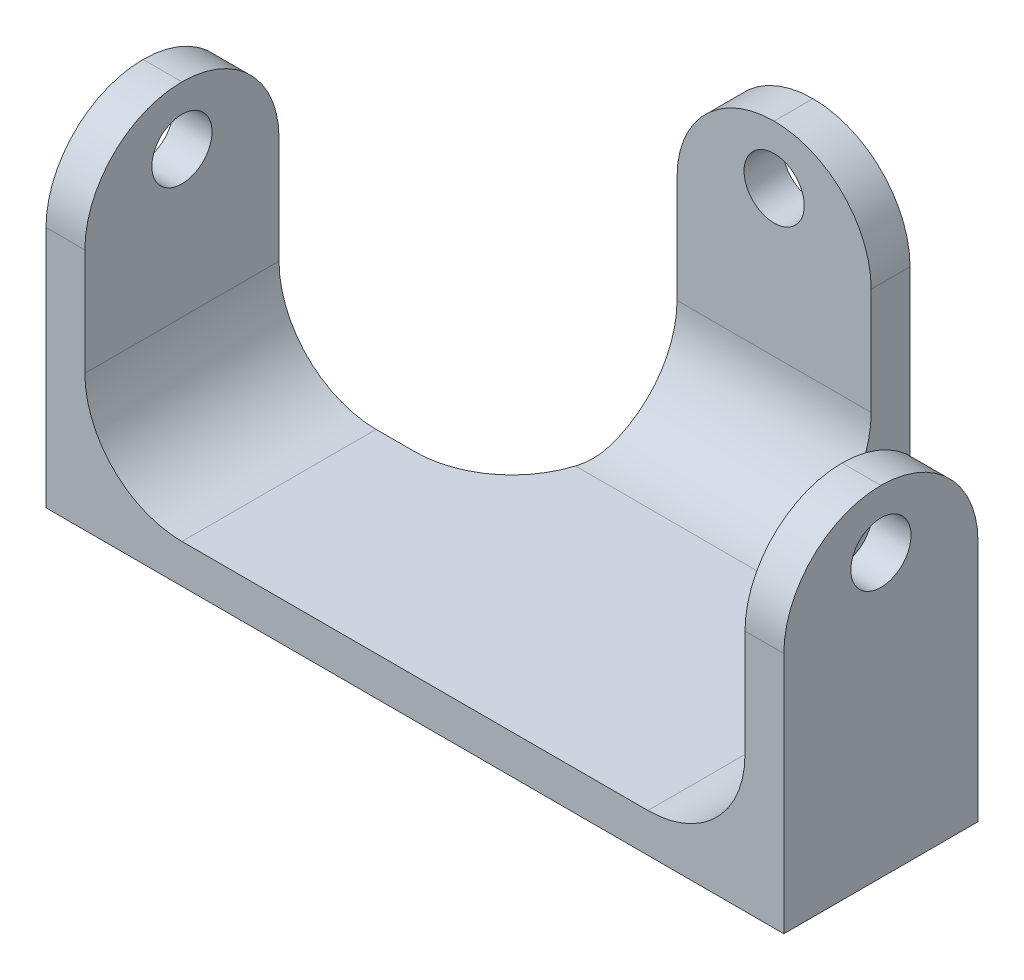
ISO-10303-21;
HEADER;
FILE_DESCRIPTION(('STEP AP214'),'2;1');
FILE_NAME('part.step','',(''),(''),'','','');
FILE_SCHEMA(('AUTOMOTIVE_DESIGN { 1 0 10303 214 1 1 1 1 }'));
ENDSEC;
DATA;
#1=APPLICATION_CONTEXT('core data for automotive mechanical design processes');
#2=APPLICATION_PROTOCOL_DEFINITION('international standard','automotive_design',2000,#1);
#3=PRODUCT_CONTEXT('',#1,'mechanical');
#4=PRODUCT('Part','Part','',(#3));
#5=PRODUCT_RELATED_PRODUCT_CATEGORY('part','',(#4));
#6=PRODUCT_DEFINITION_FORMATION('','',#4);
#7=PRODUCT_DEFINITION_CONTEXT('part definition',#1,'design');
#8=PRODUCT_DEFINITION('design','',#6,#7);
#9=PRODUCT_DEFINITION_SHAPE('','',#8);
#10=(LENGTH_UNIT() NAMED_UNIT(*) SI_UNIT(.MILLI.,.METRE.));
#11=(NAMED_UNIT(*) PLANE_ANGLE_UNIT() SI_UNIT($,.RADIAN.));
#12=(NAMED_UNIT(*) SI_UNIT($,.STERADIAN.) SOLID_ANGLE_UNIT());
#13=UNCERTAINTY_MEASURE_WITH_UNIT(LENGTH_MEASURE(1.E-05),#10,'distance_accuracy_value','');
#14=(GEOMETRIC_REPRESENTATION_CONTEXT(3) GLOBAL_UNCERTAINTY_ASSIGNED_CONTEXT((#13)) GLOBAL_UNIT_ASSIGNED_CONTEXT((#10,
#11,#12)) REPRESENTATION_CONTEXT('',''));
#15=CARTESIAN_POINT('',(0.,0.,0.));
#16=DIRECTION('',(0.,0.,1.));
#17=DIRECTION('',(1.,0.,0.));
#18=AXIS2_PLACEMENT_3D('',#15,#16,#17);
#19=CARTESIAN_POINT('',(-6.63941409911649,-24.1824796838979,62.));
#20=DIRECTION('',(0.,-1.,0.));
#21=DIRECTION('',(1.,0.,0.));
#22=AXIS2_PLACEMENT_3D('',#19,#20,#21);
#23=PLANE('',#22);
#24=DIRECTION('',(1.,0.,0.));
#25=VECTOR('',#24,1.);
#26=CARTESIAN_POINT('',(17.3605859008835,-24.1824796838979,14.));
#27=LINE('',#26,#25);
#28=CARTESIAN_POINT('',(37.821193886714,-24.1824796838979,14.));
#29=VERTEX_POINT('',#28);
#30=CARTESIAN_POINT('',(16.899977915053,-24.1824796838979,14.));
#31=VERTEX_POINT('',#30);
#32=EDGE_CURVE('E53',#29,#31,#27,.F.);
#33=ORIENTED_EDGE('',*,*,#32,.T.);
#34=CARTESIAN_POINT('',(7.3605859008835,-24.1824796838979,11.));
#35=DIRECTION('',(0.,-1.,0.));
#36=DIRECTION('',(1.,0.,0.));
#37=AXIS2_PLACEMENT_3D('',#34,#35,#36);
#38=CIRCLE('',#37,10.);
#39=CARTESIAN_POINT('',(7.3605859008835,-24.1824796838979,21.));
#40=VERTEX_POINT('',#39);
#41=EDGE_CURVE('E318',#31,#40,#38,.T.);
#42=ORIENTED_EDGE('',*,*,#41,.T.);
#43=DIRECTION('',(-1.,0.,0.));
#44=VECTOR('',#43,1.);
#45=CARTESIAN_POINT('',(-6.63941409911649,-24.1824796838979,21.));
#46=LINE('',#45,#44);
#47=CARTESIAN_POINT('',(3.3605859008835,-24.1824796838979,21.));
#48=VERTEX_POINT('',#47);
#49=EDGE_CURVE('E397',#40,#48,#46,.T.);
#50=ORIENTED_EDGE('',*,*,#49,.T.);
#51=DIRECTION('',(0.,0.,-1.));
#52=VECTOR('',#51,1.);
#53=CARTESIAN_POINT('',(3.3605859008835,-24.1824796838979,41.));
#54=LINE('',#53,#52);
#55=CARTESIAN_POINT('',(3.3605859008835,-24.1824796838979,41.));
#56=VERTEX_POINT('',#55);
#57=EDGE_CURVE('E274',#48,#56,#54,.F.);
#58=ORIENTED_EDGE('',*,*,#57,.T.);
#59=DIRECTION('',(1.,0.,0.));
#60=VECTOR('',#59,1.);
#61=CARTESIAN_POINT('',(-6.63941409911649,-24.1824796838979,41.));
#62=LINE('',#61,#60);
#63=CARTESIAN_POINT('',(51.3605859008835,-24.1824796838979,41.));
#64=VERTEX_POINT('',#63);
#65=EDGE_CURVE('E392',#56,#64,#62,.T.);
#66=ORIENTED_EDGE('',*,*,#65,.T.);
#67=DIRECTION('',(0.,0.,-1.));
#68=VECTOR('',#67,1.);
#69=CARTESIAN_POINT('',(51.3605859008835,-24.1824796838979,21.));
#70=LINE('',#69,#68);
#71=CARTESIAN_POINT('',(51.3605859008835,-24.1824796838979,21.));
#72=VERTEX_POINT('',#71);
#73=EDGE_CURVE('E270',#64,#72,#70,.T.);
#74=ORIENTED_EDGE('',*,*,#73,.T.);
#75=DIRECTION('',(-1.,0.,0.));
#76=VECTOR('',#75,1.);
#77=CARTESIAN_POINT('',(-6.63941409911649,-24.1824796838979,21.));
#78=LINE('',#77,#76);
#79=CARTESIAN_POINT('',(47.3605859008835,-24.1824796838979,21.));
#80=VERTEX_POINT('',#79);
#81=EDGE_CURVE('E407',#72,#80,#78,.T.);
#82=ORIENTED_EDGE('',*,*,#81,.T.);
#83=CARTESIAN_POINT('',(47.3605859008835,-24.1824796838979,11.));
#84=DIRECTION('',(0.,-1.,0.));
#85=DIRECTION('',(1.,0.,0.));
#86=AXIS2_PLACEMENT_3D('',#83,#84,#85);
#87=CIRCLE('',#86,10.);
#88=EDGE_CURVE('E47',#80,#29,#87,.T.);
#89=ORIENTED_EDGE('',*,*,#88,.T.);
#90=EDGE_LOOP('',(#33,#42,#50,#58,#66,#74,#82,#89));
#91=FACE_BOUND('',#90,.T.);
#92=ADVANCED_FACE('F33',(#91),#23,.F.);
#93=CARTESIAN_POINT('',(-10.6394140991165,-28.1824796838979,62.));
#94=DIRECTION('',(1.,0.,0.));
#95=DIRECTION('',(0.,1.,0.));
#96=AXIS2_PLACEMENT_3D('',#93,#94,#95);
#97=PLANE('',#96);
#98=CARTESIAN_POINT('',(-10.6394140991165,0.817520316102066,31.));
#99=DIRECTION('',(1.,0.,0.));
#100=DIRECTION('',(0.,1.,0.));
#101=AXIS2_PLACEMENT_3D('',#98,#99,#100);
#102=CIRCLE('',#101,3.1);
#103=CARTESIAN_POINT('',(-10.6394140991165,3.91752031610207,31.));
#104=VERTEX_POINT('',#103);
#105=EDGE_CURVE('E223',#104,#104,#102,.T.);
#106=ORIENTED_EDGE('',*,*,#105,.T.);
#107=EDGE_LOOP('',(#106));
#108=FACE_BOUND('',#107,.T.);
#109=CARTESIAN_POINT('',(-10.6394140991165,-3.18247968389794,31.));
#110=DIRECTION('',(1.,0.,0.));
#111=DIRECTION('',(0.,1.,0.));
#112=AXIS2_PLACEMENT_3D('',#109,#110,#111);
#113=CIRCLE('',#112,10.);
#114=CARTESIAN_POINT('',(-10.6394140991165,-3.18247968389794,41.));
#115=VERTEX_POINT('',#114);
#116=CARTESIAN_POINT('',(-10.6394140991165,6.81752031610207,31.));
#117=VERTEX_POINT('',#116);
#118=EDGE_CURVE('E240',#115,#117,#113,.F.);
#119=ORIENTED_EDGE('',*,*,#118,.T.);
#120=CARTESIAN_POINT('',(-10.6394140991165,-3.18247968389794,31.));
#121=DIRECTION('',(1.,0.,0.));
#122=DIRECTION('',(0.,1.,0.));
#123=AXIS2_PLACEMENT_3D('',#120,#121,#122);
#124=CIRCLE('',#123,10.);
#125=CARTESIAN_POINT('',(-10.6394140991165,-3.18247968389794,21.));
#126=VERTEX_POINT('',#125);
#127=EDGE_CURVE('E242',#117,#126,#124,.F.);
#128=ORIENTED_EDGE('',*,*,#127,.T.);
#129=DIRECTION('',(0.,-1.,0.));
#130=VECTOR('',#129,1.);
#131=CARTESIAN_POINT('',(-10.6394140991165,6.81752031610207,21.));
#132=LINE('',#131,#130);
#133=CARTESIAN_POINT('',(-10.6394140991165,-28.1824796838979,21.));
#134=VERTEX_POINT('',#133);
#135=EDGE_CURVE('E206',#126,#134,#132,.T.);
#136=ORIENTED_EDGE('',*,*,#135,.T.);
#137=DIRECTION('',(0.,0.,-1.));
#138=VECTOR('',#137,1.);
#139=CARTESIAN_POINT('',(-10.6394140991165,-28.1824796838979,62.));
#140=LINE('',#139,#138);
#141=CARTESIAN_POINT('',(-10.6394140991165,-28.1824796838979,41.));
#142=VERTEX_POINT('',#141);
#143=EDGE_CURVE('E202',#142,#134,#140,.T.);
#144=ORIENTED_EDGE('',*,*,#143,.F.);
#145=DIRECTION('',(0.,-1.,0.));
#146=VECTOR('',#145,1.);
#147=CARTESIAN_POINT('',(-10.6394140991165,6.81752031610207,41.));
#148=LINE('',#147,#146);
#149=EDGE_CURVE('E184',#115,#142,#148,.T.);
#150=ORIENTED_EDGE('',*,*,#149,.F.);
#151=EDGE_LOOP('',(#119,#128,#136,#144,#150));
#152=FACE_BOUND('',#151,.T.);
#153=ADVANCED_FACE('F209',(#108,#152),#97,.F.);
#154=CARTESIAN_POINT('',(65.3605859008835,-28.1824796838979,62.));
#155=DIRECTION('',(0.,1.,0.));
#156=DIRECTION('',(-1.,0.,0.));
#157=AXIS2_PLACEMENT_3D('',#154,#155,#156);
#158=PLANE('',#157);
#159=DIRECTION('',(0.,0.,-1.));
#160=VECTOR('',#159,1.);
#161=CARTESIAN_POINT('',(65.3605859008835,-28.1824796838979,62.));
#162=LINE('',#161,#160);
#163=CARTESIAN_POINT('',(65.3605859008835,-28.1824796838979,41.));
#164=VERTEX_POINT('',#163);
#165=CARTESIAN_POINT('',(65.3605859008835,-28.1824796838979,21.));
#166=VERTEX_POINT('',#165);
#167=EDGE_CURVE('E205',#164,#166,#162,.T.);
#168=ORIENTED_EDGE('',*,*,#167,.F.);
#169=DIRECTION('',(1.,0.,0.));
#170=VECTOR('',#169,1.);
#171=CARTESIAN_POINT('',(-10.6394140991165,-28.1824796838979,41.));
#172=LINE('',#171,#170);
#173=EDGE_CURVE('E188',#142,#164,#172,.T.);
#174=ORIENTED_EDGE('',*,*,#173,.F.);
#175=ORIENTED_EDGE('',*,*,#143,.T.);
#176=DIRECTION('',(-1.,0.,0.));
#177=VECTOR('',#176,1.);
#178=CARTESIAN_POINT('',(-10.6394140991165,-28.1824796838979,21.));
#179=LINE('',#178,#177);
#180=CARTESIAN_POINT('',(7.3605859008835,-28.1824796838979,21.));
#181=VERTEX_POINT('',#180);
#182=EDGE_CURVE('E443',#181,#134,#179,.T.);
#183=ORIENTED_EDGE('',*,*,#182,.F.);
#184=CARTESIAN_POINT('',(7.3605859008835,-28.1824796838979,11.));
#185=DIRECTION('',(0.,1.,0.));
#186=DIRECTION('',(-1.,0.,0.));
#187=AXIS2_PLACEMENT_3D('',#184,#185,#186);
#188=CIRCLE('',#187,10.);
#189=CARTESIAN_POINT('',(17.3605859008835,-28.1824796838979,11.));
#190=VERTEX_POINT('',#189);
#191=EDGE_CURVE('E310',#181,#190,#188,.T.);
#192=ORIENTED_EDGE('',*,*,#191,.T.);
#193=DIRECTION('',(0.,0.,1.));
#194=VECTOR('',#193,1.);
#195=CARTESIAN_POINT('',(17.3605859008835,-28.1824796838979,0.));
#196=LINE('',#195,#194);
#197=CARTESIAN_POINT('',(17.3605859008835,-28.1824796838979,0.));
#198=VERTEX_POINT('',#197);
#199=EDGE_CURVE('E428',#198,#190,#196,.T.);
#200=ORIENTED_EDGE('',*,*,#199,.F.);
#201=DIRECTION('',(1.,0.,0.));
#202=VECTOR('',#201,1.);
#203=CARTESIAN_POINT('',(65.3605859008835,-28.1824796838979,0.));
#204=LINE('',#203,#202);
#205=CARTESIAN_POINT('',(37.3605859008835,-28.1824796838979,0.));
#206=VERTEX_POINT('',#205);
#207=EDGE_CURVE('E216',#198,#206,#204,.T.);
#208=ORIENTED_EDGE('',*,*,#207,.T.);
#209=DIRECTION('',(0.,0.,-1.));
#210=VECTOR('',#209,1.);
#211=CARTESIAN_POINT('',(37.3605859008835,-28.1824796838979,0.));
#212=LINE('',#211,#210);
#213=CARTESIAN_POINT('',(37.3605859008835,-28.1824796838979,11.));
#214=VERTEX_POINT('',#213);
#215=EDGE_CURVE('E426',#214,#206,#212,.T.);
#216=ORIENTED_EDGE('',*,*,#215,.F.);
#217=CARTESIAN_POINT('',(47.3605859008835,-28.1824796838979,11.));
#218=DIRECTION('',(0.,1.,0.));
#219=DIRECTION('',(-1.,0.,0.));
#220=AXIS2_PLACEMENT_3D('',#217,#218,#219);
#221=CIRCLE('',#220,10.);
#222=CARTESIAN_POINT('',(47.3605859008835,-28.1824796838979,21.));
#223=VERTEX_POINT('',#222);
#224=EDGE_CURVE('E472',#214,#223,#221,.T.);
#225=ORIENTED_EDGE('',*,*,#224,.T.);
#226=DIRECTION('',(-1.,0.,0.));
#227=VECTOR('',#226,1.);
#228=CARTESIAN_POINT('',(65.3605859008835,-28.1824796838979,21.));
#229=LINE('',#228,#227);
#230=EDGE_CURVE('E294',#166,#223,#229,.T.);
#231=ORIENTED_EDGE('',*,*,#230,.F.);
#232=EDGE_LOOP('',(#168,#174,#175,#183,#192,#200,#208,#216,#225,#231));
#233=FACE_BOUND('',#232,.T.);
#234=ADVANCED_FACE('F200',(#233),#158,.F.);
#235=CARTESIAN_POINT('',(65.3605859008835,6.81752031610207,62.));
#236=DIRECTION('',(-1.,0.,0.));
#237=DIRECTION('',(0.,0.,1.));
#238=AXIS2_PLACEMENT_3D('',#235,#236,#237);
#239=PLANE('',#238);
#240=CARTESIAN_POINT('',(65.3605859008835,0.817520316102085,31.));
#241=DIRECTION('',(1.,0.,0.));
#242=DIRECTION('',(0.,1.,0.));
#243=AXIS2_PLACEMENT_3D('',#240,#241,#242);
#244=CIRCLE('',#243,3.1);
#245=CARTESIAN_POINT('',(65.3605859008835,3.91752031610209,31.));
#246=VERTEX_POINT('',#245);
#247=EDGE_CURVE('E414',#246,#246,#244,.T.);
#248=ORIENTED_EDGE('',*,*,#247,.F.);
#249=EDGE_LOOP('',(#248));
#250=FACE_BOUND('',#249,.T.);
#251=CARTESIAN_POINT('',(65.3605859008835,-3.18247968389793,31.));
#252=DIRECTION('',(-1.,0.,0.));
#253=DIRECTION('',(0.,0.,1.));
#254=AXIS2_PLACEMENT_3D('',#251,#252,#253);
#255=CIRCLE('',#254,10.);
#256=CARTESIAN_POINT('',(65.3605859008835,-3.18247968389793,21.));
#257=VERTEX_POINT('',#256);
#258=CARTESIAN_POINT('',(65.3605859008835,6.81752031610207,31.));
#259=VERTEX_POINT('',#258);
#260=EDGE_CURVE('E214',#257,#259,#255,.F.);
#261=ORIENTED_EDGE('',*,*,#260,.T.);
#262=CARTESIAN_POINT('',(65.3605859008835,-3.18247968389793,31.));
#263=DIRECTION('',(-1.,0.,0.));
#264=DIRECTION('',(0.,0.,1.));
#265=AXIS2_PLACEMENT_3D('',#262,#263,#264);
#266=CIRCLE('',#265,10.);
#267=CARTESIAN_POINT('',(65.3605859008835,-3.18247968389793,41.));
#268=VERTEX_POINT('',#267);
#269=EDGE_CURVE('E226',#259,#268,#266,.F.);
#270=ORIENTED_EDGE('',*,*,#269,.T.);
#271=DIRECTION('',(0.,-1.,0.));
#272=VECTOR('',#271,1.);
#273=CARTESIAN_POINT('',(65.3605859008835,6.81752031610208,41.));
#274=LINE('',#273,#272);
#275=EDGE_CURVE('E196',#268,#164,#274,.T.);
#276=ORIENTED_EDGE('',*,*,#275,.T.);
#277=ORIENTED_EDGE('',*,*,#167,.T.);
#278=DIRECTION('',(0.,-1.,0.));
#279=VECTOR('',#278,1.);
#280=CARTESIAN_POINT('',(65.3605859008835,6.81752031610208,21.));
#281=LINE('',#280,#279);
#282=EDGE_CURVE('E441',#257,#166,#281,.T.);
#283=ORIENTED_EDGE('',*,*,#282,.F.);
#284=EDGE_LOOP('',(#261,#270,#276,#277,#283));
#285=FACE_BOUND('',#284,.T.);
#286=ADVANCED_FACE('F352',(#250,#285),#239,.F.);
#287=CARTESIAN_POINT('',(61.3605859008835,-24.1824796838979,62.));
#288=DIRECTION('',(1.,0.,0.));
#289=DIRECTION('',(0.,0.,-1.));
#290=AXIS2_PLACEMENT_3D('',#287,#288,#289);
#291=PLANE('',#290);
#292=CARTESIAN_POINT('',(61.3605859008835,0.817520316102084,31.));
#293=DIRECTION('',(1.,0.,0.));
#294=DIRECTION('',(0.,0.,-1.));
#295=AXIS2_PLACEMENT_3D('',#292,#293,#294);
#296=CIRCLE('',#295,3.1);
#297=CARTESIAN_POINT('',(61.3605859008835,0.817520316102084,27.9));
#298=VERTEX_POINT('',#297);
#299=EDGE_CURVE('E222',#298,#298,#296,.T.);
#300=ORIENTED_EDGE('',*,*,#299,.T.);
#301=EDGE_LOOP('',(#300));
#302=FACE_BOUND('',#301,.T.);
#303=DIRECTION('',(0.,1.,0.));
#304=VECTOR('',#303,1.);
#305=CARTESIAN_POINT('',(61.3605859008835,-24.1824796838979,41.));
#306=LINE('',#305,#304);
#307=CARTESIAN_POINT('',(61.3605859008835,-14.1824796838979,41.));
#308=VERTEX_POINT('',#307);
#309=CARTESIAN_POINT('',(61.3605859008835,-3.18247968389793,41.));
#310=VERTEX_POINT('',#309);
#311=EDGE_CURVE('E399',#308,#310,#306,.T.);
#312=ORIENTED_EDGE('',*,*,#311,.T.);
#313=CARTESIAN_POINT('',(61.3605859008835,-3.18247968389793,31.));
#314=DIRECTION('',(1.,0.,0.));
#315=DIRECTION('',(0.,0.,-1.));
#316=AXIS2_PLACEMENT_3D('',#313,#314,#315);
#317=CIRCLE('',#316,10.);
#318=CARTESIAN_POINT('',(61.3605859008835,6.81752031610207,31.));
#319=VERTEX_POINT('',#318);
#320=EDGE_CURVE('E236',#310,#319,#317,.F.);
#321=ORIENTED_EDGE('',*,*,#320,.T.);
#322=CARTESIAN_POINT('',(61.3605859008835,-3.18247968389793,31.));
#323=DIRECTION('',(1.,0.,0.));
#324=DIRECTION('',(0.,0.,-1.));
#325=AXIS2_PLACEMENT_3D('',#322,#323,#324);
#326=CIRCLE('',#325,10.);
#327=CARTESIAN_POINT('',(61.3605859008835,-3.18247968389793,21.));
#328=VERTEX_POINT('',#327);
#329=EDGE_CURVE('E234',#319,#328,#326,.F.);
#330=ORIENTED_EDGE('',*,*,#329,.T.);
#331=DIRECTION('',(0.,-1.,0.));
#332=VECTOR('',#331,1.);
#333=CARTESIAN_POINT('',(61.3605859008835,-24.1824796838979,21.));
#334=LINE('',#333,#332);
#335=CARTESIAN_POINT('',(61.3605859008835,-14.1824796838979,21.));
#336=VERTEX_POINT('',#335);
#337=EDGE_CURVE('E211',#328,#336,#334,.T.);
#338=ORIENTED_EDGE('',*,*,#337,.T.);
#339=DIRECTION('',(0.,0.,-1.));
#340=VECTOR('',#339,1.);
#341=CARTESIAN_POINT('',(61.3605859008835,-14.1824796838979,41.));
#342=LINE('',#341,#340);
#343=EDGE_CURVE('E232',#336,#308,#342,.F.);
#344=ORIENTED_EDGE('',*,*,#343,.T.);
#345=EDGE_LOOP('',(#312,#321,#330,#338,#344));
#346=FACE_BOUND('',#345,.T.);
#347=ADVANCED_FACE('F349',(#302,#346),#291,.F.);
#348=CARTESIAN_POINT('',(-6.6394140991165,6.81752031610207,62.));
#349=DIRECTION('',(-1.,0.,0.));
#350=DIRECTION('',(0.,-1.,0.));
#351=AXIS2_PLACEMENT_3D('',#348,#349,#350);
#352=PLANE('',#351);
#353=CARTESIAN_POINT('',(-6.6394140991165,0.817520316102067,31.));
#354=DIRECTION('',(-1.,0.,0.));
#355=DIRECTION('',(0.,-1.,0.));
#356=AXIS2_PLACEMENT_3D('',#353,#354,#355);
#357=CIRCLE('',#356,3.1);
#358=CARTESIAN_POINT('',(-6.6394140991165,-2.28247968389794,31.));
#359=VERTEX_POINT('',#358);
#360=EDGE_CURVE('E220',#359,#359,#357,.T.);
#361=ORIENTED_EDGE('',*,*,#360,.T.);
#362=EDGE_LOOP('',(#361));
#363=FACE_BOUND('',#362,.T.);
#364=DIRECTION('',(0.,1.,0.));
#365=VECTOR('',#364,1.);
#366=CARTESIAN_POINT('',(-6.6394140991165,6.81752031610207,21.));
#367=LINE('',#366,#365);
#368=CARTESIAN_POINT('',(-6.6394140991165,-14.1824796838979,21.));
#369=VERTEX_POINT('',#368);
#370=CARTESIAN_POINT('',(-6.6394140991165,-3.18247968389794,21.));
#371=VERTEX_POINT('',#370);
#372=EDGE_CURVE('E401',#369,#371,#367,.T.);
#373=ORIENTED_EDGE('',*,*,#372,.T.);
#374=CARTESIAN_POINT('',(-6.6394140991165,-3.18247968389794,31.));
#375=DIRECTION('',(-1.,0.,0.));
#376=DIRECTION('',(0.,-1.,0.));
#377=AXIS2_PLACEMENT_3D('',#374,#375,#376);
#378=CIRCLE('',#377,10.);
#379=CARTESIAN_POINT('',(-6.6394140991165,6.81752031610207,31.));
#380=VERTEX_POINT('',#379);
#381=EDGE_CURVE('E252',#371,#380,#378,.F.);
#382=ORIENTED_EDGE('',*,*,#381,.T.);
#383=CARTESIAN_POINT('',(-6.6394140991165,-3.18247968389794,31.));
#384=DIRECTION('',(-1.,0.,0.));
#385=DIRECTION('',(0.,-1.,0.));
#386=AXIS2_PLACEMENT_3D('',#383,#384,#385);
#387=CIRCLE('',#386,10.);
#388=CARTESIAN_POINT('',(-6.6394140991165,-3.18247968389794,41.));
#389=VERTEX_POINT('',#388);
#390=EDGE_CURVE('E250',#380,#389,#387,.F.);
#391=ORIENTED_EDGE('',*,*,#390,.T.);
#392=DIRECTION('',(0.,-1.,0.));
#393=VECTOR('',#392,1.);
#394=CARTESIAN_POINT('',(-6.6394140991165,6.81752031610207,41.));
#395=LINE('',#394,#393);
#396=CARTESIAN_POINT('',(-6.6394140991165,-14.1824796838979,41.));
#397=VERTEX_POINT('',#396);
#398=EDGE_CURVE('E390',#389,#397,#395,.T.);
#399=ORIENTED_EDGE('',*,*,#398,.T.);
#400=DIRECTION('',(0.,0.,-1.));
#401=VECTOR('',#400,1.);
#402=CARTESIAN_POINT('',(-6.6394140991165,-14.1824796838979,21.));
#403=LINE('',#402,#401);
#404=EDGE_CURVE('E247',#397,#369,#403,.T.);
#405=ORIENTED_EDGE('',*,*,#404,.T.);
#406=EDGE_LOOP('',(#373,#382,#391,#399,#405));
#407=FACE_BOUND('',#406,.T.);
#408=ADVANCED_FACE('F347',(#363,#407),#352,.F.);
#409=CARTESIAN_POINT('',(0.,0.,0.));
#410=DIRECTION('',(0.,0.,-1.));
#411=DIRECTION('',(-1.,0.,0.));
#412=AXIS2_PLACEMENT_3D('',#409,#410,#411);
#413=PLANE('',#412);
#414=CARTESIAN_POINT('',(27.3605859008835,-3.18247968389794,0.));
#415=DIRECTION('',(0.,0.,-1.));
#416=DIRECTION('',(-1.,0.,0.));
#417=AXIS2_PLACEMENT_3D('',#414,#415,#416);
#418=CIRCLE('',#417,10.);
#419=CARTESIAN_POINT('',(17.3605859008835,-3.18247968389794,0.));
#420=VERTEX_POINT('',#419);
#421=CARTESIAN_POINT('',(27.3605859008835,6.81752031610206,0.));
#422=VERTEX_POINT('',#421);
#423=EDGE_CURVE('E264',#420,#422,#418,.T.);
#424=ORIENTED_EDGE('',*,*,#423,.T.);
#425=CARTESIAN_POINT('',(27.3605859008835,-3.18247968389794,0.));
#426=DIRECTION('',(0.,0.,-1.));
#427=DIRECTION('',(-1.,0.,0.));
#428=AXIS2_PLACEMENT_3D('',#425,#426,#427);
#429=CIRCLE('',#428,10.);
#430=CARTESIAN_POINT('',(37.3605859008835,-3.18247968389794,0.));
#431=VERTEX_POINT('',#430);
#432=EDGE_CURVE('E266',#422,#431,#429,.T.);
#433=ORIENTED_EDGE('',*,*,#432,.T.);
#434=DIRECTION('',(0.,-1.,0.));
#435=VECTOR('',#434,1.);
#436=CARTESIAN_POINT('',(37.3605859008835,6.81752031610208,0.));
#437=LINE('',#436,#435);
#438=EDGE_CURVE('E437',#431,#206,#437,.T.);
#439=ORIENTED_EDGE('',*,*,#438,.T.);
#440=ORIENTED_EDGE('',*,*,#207,.F.);
#441=DIRECTION('',(0.,-1.,0.));
#442=VECTOR('',#441,1.);
#443=CARTESIAN_POINT('',(17.3605859008835,6.81752031610208,0.));
#444=LINE('',#443,#442);
#445=EDGE_CURVE('E434',#420,#198,#444,.T.);
#446=ORIENTED_EDGE('',*,*,#445,.F.);
#447=EDGE_LOOP('',(#424,#433,#439,#440,#446));
#448=FACE_BOUND('',#447,.T.);
#449=CARTESIAN_POINT('',(27.3605859008835,0.817520316102063,0.));
#450=DIRECTION('',(0.,0.,1.));
#451=DIRECTION('',(1.,0.,0.));
#452=AXIS2_PLACEMENT_3D('',#449,#450,#451);
#453=CIRCLE('',#452,3.1);
#454=CARTESIAN_POINT('',(30.4605859008835,0.817520316102063,0.));
#455=VERTEX_POINT('',#454);
#456=EDGE_CURVE('E411',#455,#455,#453,.T.);
#457=ORIENTED_EDGE('',*,*,#456,.T.);
#458=EDGE_LOOP('',(#457));
#459=FACE_BOUND('',#458,.T.);
#460=ADVANCED_FACE('F432',(#448,#459),#413,.T.);
#461=CARTESIAN_POINT('',(-3.63941409911649,6.81752031610206,4.00000000000001));
#462=DIRECTION('',(0.,0.,-1.));
#463=DIRECTION('',(-1.,0.,0.));
#464=AXIS2_PLACEMENT_3D('',#461,#462,#463);
#465=PLANE('',#464);
#466=CARTESIAN_POINT('',(27.3605859008835,0.817520316102063,4.00000000000001));
#467=DIRECTION('',(0.,0.,1.));
#468=DIRECTION('',(1.,0.,0.));
#469=AXIS2_PLACEMENT_3D('',#466,#467,#468);
#470=CIRCLE('',#469,3.1);
#471=CARTESIAN_POINT('',(30.4605859008835,0.817520316102063,4.00000000000001));
#472=VERTEX_POINT('',#471);
#473=EDGE_CURVE('E410',#472,#472,#470,.T.);
#474=ORIENTED_EDGE('',*,*,#473,.F.);
#475=EDGE_LOOP('',(#474));
#476=FACE_BOUND('',#475,.T.);
#477=DIRECTION('',(0.,1.,0.));
#478=VECTOR('',#477,1.);
#479=CARTESIAN_POINT('',(37.3605859008835,6.81752031610207,4.));
#480=LINE('',#479,#478);
#481=CARTESIAN_POINT('',(37.3605859008835,-14.1824796838979,4.));
#482=VERTEX_POINT('',#481);
#483=CARTESIAN_POINT('',(37.3605859008835,-3.18247968389794,4.));
#484=VERTEX_POINT('',#483);
#485=EDGE_CURVE('E449',#482,#484,#480,.T.);
#486=ORIENTED_EDGE('',*,*,#485,.T.);
#487=CARTESIAN_POINT('',(27.3605859008835,-3.18247968389794,4.00000000000001));
#488=DIRECTION('',(0.,0.,-1.));
#489=DIRECTION('',(-1.,0.,0.));
#490=AXIS2_PLACEMENT_3D('',#487,#488,#489);
#491=CIRCLE('',#490,10.);
#492=CARTESIAN_POINT('',(27.3605859008835,6.81752031610206,4.00000000000001));
#493=VERTEX_POINT('',#492);
#494=EDGE_CURVE('E262',#484,#493,#491,.F.);
#495=ORIENTED_EDGE('',*,*,#494,.T.);
#496=CARTESIAN_POINT('',(27.3605859008835,-3.18247968389794,4.00000000000001));
#497=DIRECTION('',(0.,0.,-1.));
#498=DIRECTION('',(-1.,0.,0.));
#499=AXIS2_PLACEMENT_3D('',#496,#497,#498);
#500=CIRCLE('',#499,10.);
#501=CARTESIAN_POINT('',(17.3605859008835,-3.18247968389794,4.00000000000001));
#502=VERTEX_POINT('',#501);
#503=EDGE_CURVE('E260',#493,#502,#500,.F.);
#504=ORIENTED_EDGE('',*,*,#503,.T.);
#505=DIRECTION('',(0.,-1.,0.));
#506=VECTOR('',#505,1.);
#507=CARTESIAN_POINT('',(17.3605859008835,6.81752031610206,4.00000000000001));
#508=LINE('',#507,#506);
#509=CARTESIAN_POINT('',(17.3605859008835,-14.1824796838979,4.00000000000001));
#510=VERTEX_POINT('',#509);
#511=EDGE_CURVE('E452',#502,#510,#508,.T.);
#512=ORIENTED_EDGE('',*,*,#511,.T.);
#513=DIRECTION('',(1.,0.,0.));
#514=VECTOR('',#513,1.);
#515=CARTESIAN_POINT('',(37.3605859008835,-14.1824796838979,4.));
#516=LINE('',#515,#514);
#517=EDGE_CURVE('E257',#510,#482,#516,.T.);
#518=ORIENTED_EDGE('',*,*,#517,.T.);
#519=EDGE_LOOP('',(#486,#495,#504,#512,#518));
#520=FACE_BOUND('',#519,.T.);
#521=ADVANCED_FACE('F485',(#476,#520),#465,.F.);
#522=CARTESIAN_POINT('',(-10.6394140991165,0.817520316102066,31.));
#523=DIRECTION('',(1.,0.,0.));
#524=DIRECTION('',(0.,1.,0.));
#525=AXIS2_PLACEMENT_3D('',#522,#523,#524);
#526=CYLINDRICAL_SURFACE('',#525,3.1);
#527=ORIENTED_EDGE('',*,*,#105,.F.);
#528=EDGE_LOOP('',(#527));
#529=FACE_BOUND('',#528,.T.);
#530=ORIENTED_EDGE('',*,*,#360,.F.);
#531=EDGE_LOOP('',(#530));
#532=FACE_BOUND('',#531,.T.);
#533=ADVANCED_FACE('F488',(#529,#532),#526,.F.);
#534=ORIENTED_EDGE('',*,*,#247,.T.);
#535=EDGE_LOOP('',(#534));
#536=FACE_BOUND('',#535,.T.);
#537=ORIENTED_EDGE('',*,*,#299,.F.);
#538=EDGE_LOOP('',(#537));
#539=FACE_BOUND('',#538,.T.);
#540=ADVANCED_FACE('F496',(#536,#539),#526,.F.);
#541=CARTESIAN_POINT('',(27.3605859008835,0.817520316102063,0.));
#542=DIRECTION('',(0.,0.,1.));
#543=DIRECTION('',(1.,0.,0.));
#544=AXIS2_PLACEMENT_3D('',#541,#542,#543);
#545=CYLINDRICAL_SURFACE('',#544,3.1);
#546=ORIENTED_EDGE('',*,*,#456,.F.);
#547=EDGE_LOOP('',(#546));
#548=FACE_BOUND('',#547,.T.);
#549=ORIENTED_EDGE('',*,*,#473,.T.);
#550=EDGE_LOOP('',(#549));
#551=FACE_BOUND('',#550,.T.);
#552=ADVANCED_FACE('F502',(#548,#551),#545,.F.);
#553=CARTESIAN_POINT('',(65.3605859008835,6.81752031610208,21.));
#554=DIRECTION('',(0.,0.,1.));
#555=DIRECTION('',(1.,0.,0.));
#556=AXIS2_PLACEMENT_3D('',#553,#554,#555);
#557=PLANE('',#556);
#558=ORIENTED_EDGE('',*,*,#230,.T.);
#559=DIRECTION('',(0.,-1.,0.));
#560=VECTOR('',#559,1.);
#561=CARTESIAN_POINT('',(47.3605859008835,-24.1824796838979,21.));
#562=LINE('',#561,#560);
#563=EDGE_CURVE('E308',#223,#80,#562,.F.);
#564=ORIENTED_EDGE('',*,*,#563,.T.);
#565=ORIENTED_EDGE('',*,*,#81,.F.);
#566=CARTESIAN_POINT('',(51.3605859008835,-14.1824796838979,21.));
#567=DIRECTION('',(0.,0.,1.));
#568=DIRECTION('',(1.,0.,0.));
#569=AXIS2_PLACEMENT_3D('',#566,#567,#568);
#570=CIRCLE('',#569,10.);
#571=EDGE_CURVE('E286',#72,#336,#570,.T.);
#572=ORIENTED_EDGE('',*,*,#571,.T.);
#573=ORIENTED_EDGE('',*,*,#337,.F.);
#574=DIRECTION('',(-1.,0.,0.));
#575=VECTOR('',#574,1.);
#576=CARTESIAN_POINT('',(65.3605859008835,-3.18247968389793,21.));
#577=LINE('',#576,#575);
#578=EDGE_CURVE('E238',#328,#257,#577,.F.);
#579=ORIENTED_EDGE('',*,*,#578,.T.);
#580=ORIENTED_EDGE('',*,*,#282,.T.);
#581=EDGE_LOOP('',(#558,#564,#565,#572,#573,#579,#580));
#582=FACE_BOUND('',#581,.T.);
#583=ADVANCED_FACE('F506',(#582),#557,.F.);
#584=CARTESIAN_POINT('',(37.3605859008835,6.81752031610208,0.));
#585=DIRECTION('',(-1.,0.,0.));
#586=DIRECTION('',(0.,-1.,0.));
#587=AXIS2_PLACEMENT_3D('',#584,#585,#586);
#588=PLANE('',#587);
#589=CARTESIAN_POINT('',(37.3605859008835,-14.1824796838979,14.));
#590=DIRECTION('',(-1.,0.,0.));
#591=DIRECTION('',(0.,-1.,0.));
#592=AXIS2_PLACEMENT_3D('',#589,#590,#591);
#593=CIRCLE('',#592,10.);
#594=CARTESIAN_POINT('',(37.3605859008835,-23.7218716980674,11.));
#595=VERTEX_POINT('',#594);
#596=EDGE_CURVE('E281',#482,#595,#593,.T.);
#597=ORIENTED_EDGE('',*,*,#596,.T.);
#598=DIRECTION('',(0.,-1.,0.));
#599=VECTOR('',#598,1.);
#600=CARTESIAN_POINT('',(37.3605859008835,-28.1824796838979,11.));
#601=LINE('',#600,#599);
#602=EDGE_CURVE('E305',#595,#214,#601,.T.);
#603=ORIENTED_EDGE('',*,*,#602,.T.);
#604=ORIENTED_EDGE('',*,*,#215,.T.);
#605=ORIENTED_EDGE('',*,*,#438,.F.);
#606=DIRECTION('',(0.,0.,1.));
#607=VECTOR('',#606,1.);
#608=CARTESIAN_POINT('',(37.3605859008835,-3.18247968389794,4.00000000000001));
#609=LINE('',#608,#607);
#610=EDGE_CURVE('E254',#431,#484,#609,.T.);
#611=ORIENTED_EDGE('',*,*,#610,.T.);
#612=ORIENTED_EDGE('',*,*,#485,.F.);
#613=EDGE_LOOP('',(#597,#603,#604,#605,#611,#612));
#614=FACE_BOUND('',#613,.T.);
#615=ADVANCED_FACE('F466',(#614),#588,.F.);
#616=CARTESIAN_POINT('',(-10.6394140991165,6.81752031610207,21.));
#617=DIRECTION('',(0.,0.,1.));
#618=DIRECTION('',(1.,0.,0.));
#619=AXIS2_PLACEMENT_3D('',#616,#617,#618);
#620=PLANE('',#619);
#621=ORIENTED_EDGE('',*,*,#49,.F.);
#622=DIRECTION('',(0.,-1.,0.));
#623=VECTOR('',#622,1.);
#624=CARTESIAN_POINT('',(7.3605859008835,-28.1824796838979,21.));
#625=LINE('',#624,#623);
#626=EDGE_CURVE('E290',#40,#181,#625,.T.);
#627=ORIENTED_EDGE('',*,*,#626,.T.);
#628=ORIENTED_EDGE('',*,*,#182,.T.);
#629=ORIENTED_EDGE('',*,*,#135,.F.);
#630=DIRECTION('',(-1.,0.,0.));
#631=VECTOR('',#630,1.);
#632=CARTESIAN_POINT('',(-10.6394140991165,-3.18247968389794,21.));
#633=LINE('',#632,#631);
#634=EDGE_CURVE('E244',#126,#371,#633,.F.);
#635=ORIENTED_EDGE('',*,*,#634,.T.);
#636=ORIENTED_EDGE('',*,*,#372,.F.);
#637=CARTESIAN_POINT('',(3.3605859008835,-14.1824796838979,21.));
#638=DIRECTION('',(0.,0.,1.));
#639=DIRECTION('',(1.,0.,0.));
#640=AXIS2_PLACEMENT_3D('',#637,#638,#639);
#641=CIRCLE('',#640,10.);
#642=EDGE_CURVE('E276',#369,#48,#641,.T.);
#643=ORIENTED_EDGE('',*,*,#642,.T.);
#644=EDGE_LOOP('',(#621,#627,#628,#629,#635,#636,#643));
#645=FACE_BOUND('',#644,.T.);
#646=ADVANCED_FACE('F456',(#645),#620,.F.);
#647=CARTESIAN_POINT('',(17.3605859008835,6.81752031610208,0.));
#648=DIRECTION('',(1.,0.,0.));
#649=DIRECTION('',(0.,1.,0.));
#650=AXIS2_PLACEMENT_3D('',#647,#648,#649);
#651=PLANE('',#650);
#652=ORIENTED_EDGE('',*,*,#199,.T.);
#653=DIRECTION('',(0.,-1.,0.));
#654=VECTOR('',#653,1.);
#655=CARTESIAN_POINT('',(17.3605859008835,-24.1824796838979,11.));
#656=LINE('',#655,#654);
#657=CARTESIAN_POINT('',(17.3605859008835,-23.7218716980674,11.));
#658=VERTEX_POINT('',#657);
#659=EDGE_CURVE('E303',#190,#658,#656,.F.);
#660=ORIENTED_EDGE('',*,*,#659,.T.);
#661=CARTESIAN_POINT('',(17.3605859008835,-14.1824796838979,14.));
#662=DIRECTION('',(1.,0.,0.));
#663=DIRECTION('',(0.,1.,0.));
#664=AXIS2_PLACEMENT_3D('',#661,#662,#663);
#665=CIRCLE('',#664,10.);
#666=EDGE_CURVE('E284',#658,#510,#665,.T.);
#667=ORIENTED_EDGE('',*,*,#666,.T.);
#668=ORIENTED_EDGE('',*,*,#511,.F.);
#669=DIRECTION('',(0.,0.,1.));
#670=VECTOR('',#669,1.);
#671=CARTESIAN_POINT('',(17.3605859008835,-3.18247968389794,0.));
#672=LINE('',#671,#670);
#673=EDGE_CURVE('E268',#502,#420,#672,.F.);
#674=ORIENTED_EDGE('',*,*,#673,.T.);
#675=ORIENTED_EDGE('',*,*,#445,.T.);
#676=EDGE_LOOP('',(#652,#660,#667,#668,#674,#675));
#677=FACE_BOUND('',#676,.T.);
#678=ADVANCED_FACE('F478',(#677),#651,.F.);
#679=CARTESIAN_POINT('',(-10.6394140991165,6.81752031610207,41.));
#680=DIRECTION('',(0.,0.,-1.));
#681=DIRECTION('',(-1.,0.,0.));
#682=AXIS2_PLACEMENT_3D('',#679,#680,#681);
#683=PLANE('',#682);
#684=ORIENTED_EDGE('',*,*,#275,.F.);
#685=DIRECTION('',(1.,0.,0.));
#686=VECTOR('',#685,1.);
#687=CARTESIAN_POINT('',(-10.6394140991165,-3.18247968389795,41.));
#688=LINE('',#687,#686);
#689=EDGE_CURVE('E229',#268,#310,#688,.F.);
#690=ORIENTED_EDGE('',*,*,#689,.T.);
#691=ORIENTED_EDGE('',*,*,#311,.F.);
#692=CARTESIAN_POINT('',(51.3605859008835,-14.1824796838979,41.));
#693=DIRECTION('',(0.,0.,-1.));
#694=DIRECTION('',(-1.,0.,0.));
#695=AXIS2_PLACEMENT_3D('',#692,#693,#694);
#696=CIRCLE('',#695,10.);
#697=EDGE_CURVE('E288',#308,#64,#696,.T.);
#698=ORIENTED_EDGE('',*,*,#697,.T.);
#699=ORIENTED_EDGE('',*,*,#65,.F.);
#700=CARTESIAN_POINT('',(3.3605859008835,-14.1824796838979,41.));
#701=DIRECTION('',(0.,0.,-1.));
#702=DIRECTION('',(-1.,0.,0.));
#703=AXIS2_PLACEMENT_3D('',#700,#701,#702);
#704=CIRCLE('',#703,10.);
#705=EDGE_CURVE('E279',#56,#397,#704,.T.);
#706=ORIENTED_EDGE('',*,*,#705,.T.);
#707=ORIENTED_EDGE('',*,*,#398,.F.);
#708=DIRECTION('',(1.,0.,0.));
#709=VECTOR('',#708,1.);
#710=CARTESIAN_POINT('',(-10.6394140991165,-3.18247968389794,41.));
#711=LINE('',#710,#709);
#712=EDGE_CURVE('E192',#389,#115,#711,.F.);
#713=ORIENTED_EDGE('',*,*,#712,.T.);
#714=ORIENTED_EDGE('',*,*,#149,.T.);
#715=ORIENTED_EDGE('',*,*,#173,.T.);
#716=EDGE_LOOP('',(#684,#690,#691,#698,#699,#706,#707,#713,#714,#715));
#717=FACE_BOUND('',#716,.T.);
#718=ADVANCED_FACE('F187',(#717),#683,.F.);
#719=CARTESIAN_POINT('',(61.3605859008835,-3.18247968389793,31.));
#720=DIRECTION('',(-1.,0.,0.));
#721=DIRECTION('',(0.,-1.,0.));
#722=AXIS2_PLACEMENT_3D('',#719,#720,#721);
#723=CYLINDRICAL_SURFACE('',#722,10.);
#724=ORIENTED_EDGE('',*,*,#578,.F.);
#725=ORIENTED_EDGE('',*,*,#329,.F.);
#726=DIRECTION('',(-1.,0.,0.));
#727=VECTOR('',#726,1.);
#728=CARTESIAN_POINT('',(61.3605859008835,6.81752031610207,31.));
#729=LINE('',#728,#727);
#730=EDGE_CURVE('E291',#259,#319,#729,.T.);
#731=ORIENTED_EDGE('',*,*,#730,.F.);
#732=ORIENTED_EDGE('',*,*,#260,.F.);
#733=EDGE_LOOP('',(#724,#725,#731,#732));
#734=FACE_BOUND('',#733,.T.);
#735=ADVANCED_FACE('F362',(#734),#723,.T.);
#736=CARTESIAN_POINT('',(61.3605859008835,-3.18247968389793,31.));
#737=DIRECTION('',(1.,0.,0.));
#738=DIRECTION('',(0.,1.,0.));
#739=AXIS2_PLACEMENT_3D('',#736,#737,#738);
#740=CYLINDRICAL_SURFACE('',#739,10.);
#741=ORIENTED_EDGE('',*,*,#320,.F.);
#742=ORIENTED_EDGE('',*,*,#689,.F.);
#743=ORIENTED_EDGE('',*,*,#269,.F.);
#744=ORIENTED_EDGE('',*,*,#730,.T.);
#745=EDGE_LOOP('',(#741,#742,#743,#744));
#746=FACE_BOUND('',#745,.T.);
#747=ADVANCED_FACE('F358',(#746),#740,.T.);
#748=CARTESIAN_POINT('',(-10.6394140991165,-3.18247968389794,31.));
#749=DIRECTION('',(1.,0.,0.));
#750=DIRECTION('',(0.,0.,-1.));
#751=AXIS2_PLACEMENT_3D('',#748,#749,#750);
#752=CYLINDRICAL_SURFACE('',#751,10.);
#753=ORIENTED_EDGE('',*,*,#712,.F.);
#754=ORIENTED_EDGE('',*,*,#390,.F.);
#755=DIRECTION('',(1.,0.,0.));
#756=VECTOR('',#755,1.);
#757=CARTESIAN_POINT('',(-10.6394140991165,6.81752031610207,31.));
#758=LINE('',#757,#756);
#759=EDGE_CURVE('E295',#117,#380,#758,.T.);
#760=ORIENTED_EDGE('',*,*,#759,.F.);
#761=ORIENTED_EDGE('',*,*,#118,.F.);
#762=EDGE_LOOP('',(#753,#754,#760,#761));
#763=FACE_BOUND('',#762,.T.);
#764=ADVANCED_FACE('F361',(#763),#752,.T.);
#765=CARTESIAN_POINT('',(-10.6394140991165,-3.18247968389794,31.));
#766=DIRECTION('',(-1.,0.,0.));
#767=DIRECTION('',(0.,0.,1.));
#768=AXIS2_PLACEMENT_3D('',#765,#766,#767);
#769=CYLINDRICAL_SURFACE('',#768,10.);
#770=ORIENTED_EDGE('',*,*,#381,.F.);
#771=ORIENTED_EDGE('',*,*,#634,.F.);
#772=ORIENTED_EDGE('',*,*,#127,.F.);
#773=ORIENTED_EDGE('',*,*,#759,.T.);
#774=EDGE_LOOP('',(#770,#771,#772,#773));
#775=FACE_BOUND('',#774,.T.);
#776=ADVANCED_FACE('F367',(#775),#769,.T.);
#777=CARTESIAN_POINT('',(27.3605859008835,-3.18247968389794,0.));
#778=DIRECTION('',(0.,0.,-1.));
#779=DIRECTION('',(-1.,0.,0.));
#780=AXIS2_PLACEMENT_3D('',#777,#778,#779);
#781=CYLINDRICAL_SURFACE('',#780,10.);
#782=DIRECTION('',(0.,0.,1.));
#783=VECTOR('',#782,1.);
#784=CARTESIAN_POINT('',(27.3605859008835,6.81752031610206,4.00000000000001));
#785=LINE('',#784,#783);
#786=EDGE_CURVE('E298',#422,#493,#785,.T.);
#787=ORIENTED_EDGE('',*,*,#786,.F.);
#788=ORIENTED_EDGE('',*,*,#423,.F.);
#789=ORIENTED_EDGE('',*,*,#673,.F.);
#790=ORIENTED_EDGE('',*,*,#503,.F.);
#791=EDGE_LOOP('',(#787,#788,#789,#790));
#792=FACE_BOUND('',#791,.T.);
#793=ADVANCED_FACE('F370',(#792),#781,.T.);
#794=CARTESIAN_POINT('',(27.3605859008835,-3.18247968389794,0.));
#795=DIRECTION('',(0.,0.,-1.));
#796=DIRECTION('',(-1.,0.,0.));
#797=AXIS2_PLACEMENT_3D('',#794,#795,#796);
#798=CYLINDRICAL_SURFACE('',#797,10.);
#799=ORIENTED_EDGE('',*,*,#432,.F.);
#800=ORIENTED_EDGE('',*,*,#786,.T.);
#801=ORIENTED_EDGE('',*,*,#494,.F.);
#802=ORIENTED_EDGE('',*,*,#610,.F.);
#803=EDGE_LOOP('',(#799,#800,#801,#802));
#804=FACE_BOUND('',#803,.T.);
#805=ADVANCED_FACE('F375',(#804),#798,.T.);
#806=CARTESIAN_POINT('',(3.3605859008835,-14.1824796838979,62.));
#807=DIRECTION('',(0.,0.,1.));
#808=DIRECTION('',(1.,0.,0.));
#809=AXIS2_PLACEMENT_3D('',#806,#807,#808);
#810=CYLINDRICAL_SURFACE('',#809,10.);
#811=ORIENTED_EDGE('',*,*,#705,.F.);
#812=ORIENTED_EDGE('',*,*,#57,.F.);
#813=ORIENTED_EDGE('',*,*,#642,.F.);
#814=ORIENTED_EDGE('',*,*,#404,.F.);
#815=EDGE_LOOP('',(#811,#812,#813,#814));
#816=FACE_BOUND('',#815,.T.);
#817=ADVANCED_FACE('F335',(#816),#810,.F.);
#818=CARTESIAN_POINT('',(-3.63941409911649,-14.1824796838979,14.));
#819=DIRECTION('',(-1.,0.,0.));
#820=DIRECTION('',(0.,0.,1.));
#821=AXIS2_PLACEMENT_3D('',#818,#819,#820);
#822=CYLINDRICAL_SURFACE('',#821,10.);
#823=ORIENTED_EDGE('',*,*,#666,.F.);
#824=CARTESIAN_POINT('',(17.3605859008835,-23.7218716980674,11.));
#825=CARTESIAN_POINT('',(17.360626464917,-23.7834545410689,11.195679813317));
#826=CARTESIAN_POINT('',(17.3548437747514,-23.8389442584154,11.3933023492823));
#827=CARTESIAN_POINT('',(17.331232812701,-23.9375857518712,11.7910019624633));
#828=CARTESIAN_POINT('',(17.3133981589751,-23.980730973998,11.9910802849445));
#829=CARTESIAN_POINT('',(17.2657104457778,-24.0538115684894,12.3884903942247));
#830=CARTESIAN_POINT('',(17.2360763896052,-24.0839678753819,12.58580787503));
#831=CARTESIAN_POINT('',(17.1647239707375,-24.1322589666206,12.9796121357673));
#832=CARTESIAN_POINT('',(17.1230135708936,-24.1504016466361,13.1760993768007));
#833=CARTESIAN_POINT('',(17.0496266700602,-24.1693385445831,13.4767426188429));
#834=CARTESIAN_POINT('',(17.0221885139758,-24.1742746950896,13.5817067929167));
#835=CARTESIAN_POINT('',(16.963740776377,-24.1808540103382,13.7912922965914));
#836=CARTESIAN_POINT('',(16.9327144499012,-24.18248101827,13.89590946593));
#837=CARTESIAN_POINT('',(16.899977915053,-24.1824796838979,14.));
#838=B_SPLINE_CURVE_WITH_KNOTS('',3,(#824,#825,#826,#827,#828,#829,#830,#831,#832,#833,#834,
#835,#836,#837),.UNSPECIFIED.,.F.,.F.,(4,2,2,2,2,2,4),(0.,0.615282039656371,1.23089014338196,
1.83556840218196,2.43984885515918,2.76556374984207,3.092865158743),.UNSPECIFIED.);
#839=EDGE_CURVE('E312',#658,#31,#838,.T.);
#840=ORIENTED_EDGE('',*,*,#839,.T.);
#841=ORIENTED_EDGE('',*,*,#32,.F.);
#842=CARTESIAN_POINT('',(37.821193886714,-24.1824796838979,14.));
#843=CARTESIAN_POINT('',(37.7596110437126,-24.1825202479314,13.804320186683));
#844=CARTESIAN_POINT('',(37.704121326366,-24.1767375577659,13.6066976507177));
#845=CARTESIAN_POINT('',(37.6054798329102,-24.1531265957154,13.2089980375367));
#846=CARTESIAN_POINT('',(37.5623346107834,-24.1352919419895,13.0089197150555));
#847=CARTESIAN_POINT('',(37.489254016292,-24.0876042287922,12.6115096057753));
#848=CARTESIAN_POINT('',(37.4590977093995,-24.0579701726196,12.41419212497));
#849=CARTESIAN_POINT('',(37.4108066181608,-23.9866177537519,12.0203878642327));
#850=CARTESIAN_POINT('',(37.3926639381453,-23.944907353908,11.8239006231993));
#851=CARTESIAN_POINT('',(37.3737270401983,-23.8715204530746,11.5232573811571));
#852=CARTESIAN_POINT('',(37.3687908896919,-23.8440822969902,11.4182932070833));
#853=CARTESIAN_POINT('',(37.3622115744432,-23.7856345593914,11.2087077034086));
#854=CARTESIAN_POINT('',(37.3605845665115,-23.7546082329157,11.10409053407));
#855=CARTESIAN_POINT('',(37.3605859008835,-23.7218716980674,11.));
#856=B_SPLINE_CURVE_WITH_KNOTS('',3,(#842,#843,#844,#845,#846,#847,#848,#849,#850,#851,#852,
#853,#854,#855),.UNSPECIFIED.,.F.,.F.,(4,2,2,2,2,2,4),(0.,0.615282039656369,1.23089014338195,
1.83556840218196,2.43984885515918,2.76556374984207,3.09286515874299),.UNSPECIFIED.);
#857=EDGE_CURVE('E11',#29,#595,#856,.T.);
#858=ORIENTED_EDGE('',*,*,#857,.T.);
#859=ORIENTED_EDGE('',*,*,#596,.F.);
#860=ORIENTED_EDGE('',*,*,#517,.F.);
#861=EDGE_LOOP('',(#823,#840,#841,#858,#859,#860));
#862=FACE_BOUND('',#861,.T.);
#863=ADVANCED_FACE('F320',(#862),#822,.F.);
#864=CARTESIAN_POINT('',(51.3605859008835,-14.1824796838979,62.));
#865=DIRECTION('',(0.,0.,1.));
#866=DIRECTION('',(1.,0.,0.));
#867=AXIS2_PLACEMENT_3D('',#864,#865,#866);
#868=CYLINDRICAL_SURFACE('',#867,10.);
#869=ORIENTED_EDGE('',*,*,#697,.F.);
#870=ORIENTED_EDGE('',*,*,#343,.F.);
#871=ORIENTED_EDGE('',*,*,#571,.F.);
#872=ORIENTED_EDGE('',*,*,#73,.F.);
#873=EDGE_LOOP('',(#869,#870,#871,#872));
#874=FACE_BOUND('',#873,.T.);
#875=ADVANCED_FACE('F327',(#874),#868,.F.);
#876=CARTESIAN_POINT('',(7.3605859008835,6.81752031610207,11.));
#877=DIRECTION('',(0.,1.,0.));
#878=DIRECTION('',(-1.,0.,0.));
#879=AXIS2_PLACEMENT_3D('',#876,#877,#878);
#880=CYLINDRICAL_SURFACE('',#879,10.);
#881=ORIENTED_EDGE('',*,*,#839,.F.);
#882=ORIENTED_EDGE('',*,*,#659,.F.);
#883=ORIENTED_EDGE('',*,*,#191,.F.);
#884=ORIENTED_EDGE('',*,*,#626,.F.);
#885=ORIENTED_EDGE('',*,*,#41,.F.);
#886=EDGE_LOOP('',(#881,#882,#883,#884,#885));
#887=FACE_BOUND('',#886,.T.);
#888=ADVANCED_FACE('F324',(#887),#880,.F.);
#889=CARTESIAN_POINT('',(47.3605859008835,6.81752031610208,11.));
#890=DIRECTION('',(0.,1.,0.));
#891=DIRECTION('',(-1.,0.,0.));
#892=AXIS2_PLACEMENT_3D('',#889,#890,#891);
#893=CYLINDRICAL_SURFACE('',#892,10.);
#894=ORIENTED_EDGE('',*,*,#88,.F.);
#895=ORIENTED_EDGE('',*,*,#563,.F.);
#896=ORIENTED_EDGE('',*,*,#224,.F.);
#897=ORIENTED_EDGE('',*,*,#602,.F.);
#898=ORIENTED_EDGE('',*,*,#857,.F.);
#899=EDGE_LOOP('',(#894,#895,#896,#897,#898));
#900=FACE_BOUND('',#899,.T.);
#901=ADVANCED_FACE('F35',(#900),#893,.F.);
#902=CLOSED_SHELL('',(#92,#153,#234,#286,#347,#408,#460,#521,#533,#540,#552,#583,#615,#646,#678,
#718,#735,#747,#764,#776,#793,#805,#817,#863,#875,#888,#901));
#903=MANIFOLD_SOLID_BREP('B2',#902);
#904=ADVANCED_BREP_SHAPE_REPRESENTATION('',(#18,#903),#14);
#905=SHAPE_DEFINITION_REPRESENTATION(#9,#904);
ENDSEC;
END-ISO-10303-21;
